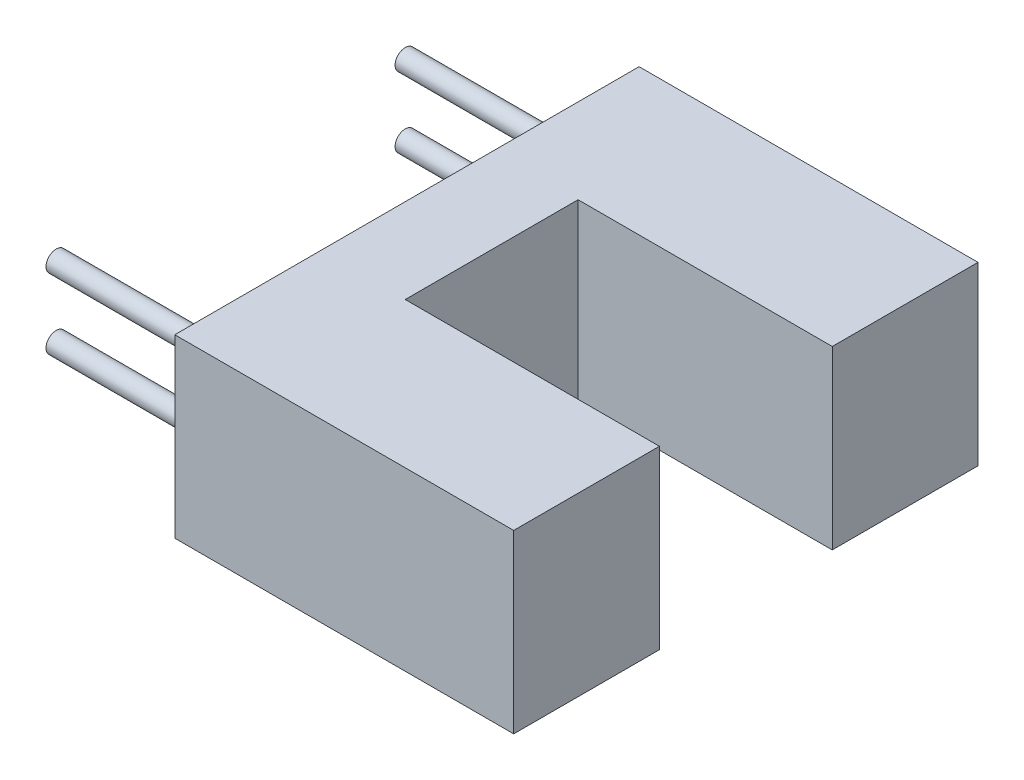
ISO-10303-21;
HEADER;
FILE_DESCRIPTION(('STEP AP214'),'2;1');
FILE_NAME('part.step','',(''),(''),'','','');
FILE_SCHEMA(('AUTOMOTIVE_DESIGN { 1 0 10303 214 1 1 1 1 }'));
ENDSEC;
DATA;
#1=APPLICATION_CONTEXT('core data for automotive mechanical design processes');
#2=APPLICATION_PROTOCOL_DEFINITION('international standard','automotive_design',2000,#1);
#3=PRODUCT_CONTEXT('',#1,'mechanical');
#4=PRODUCT('Part','Part','',(#3));
#5=PRODUCT_RELATED_PRODUCT_CATEGORY('part','',(#4));
#6=PRODUCT_DEFINITION_FORMATION('','',#4);
#7=PRODUCT_DEFINITION_CONTEXT('part definition',#1,'design');
#8=PRODUCT_DEFINITION('design','',#6,#7);
#9=PRODUCT_DEFINITION_SHAPE('','',#8);
#10=(LENGTH_UNIT() NAMED_UNIT(*) SI_UNIT(.MILLI.,.METRE.));
#11=(NAMED_UNIT(*) PLANE_ANGLE_UNIT() SI_UNIT($,.RADIAN.));
#12=(NAMED_UNIT(*) SI_UNIT($,.STERADIAN.) SOLID_ANGLE_UNIT());
#13=UNCERTAINTY_MEASURE_WITH_UNIT(LENGTH_MEASURE(1.E-05),#10,'distance_accuracy_value','');
#14=(GEOMETRIC_REPRESENTATION_CONTEXT(3) GLOBAL_UNCERTAINTY_ASSIGNED_CONTEXT((#13)) GLOBAL_UNIT_ASSIGNED_CONTEXT((#10,
#11,#12)) REPRESENTATION_CONTEXT('',''));
#15=CARTESIAN_POINT('',(0.,0.,0.));
#16=DIRECTION('',(0.,0.,1.));
#17=DIRECTION('',(1.,0.,0.));
#18=AXIS2_PLACEMENT_3D('',#15,#16,#17);
#19=CARTESIAN_POINT('',(10.,5.2,0.));
#20=DIRECTION('',(0.,0.,-1.));
#21=DIRECTION('',(-1.,0.,0.));
#22=AXIS2_PLACEMENT_3D('',#19,#20,#21);
#23=PLANE('',#22);
#24=DIRECTION('',(1.,0.,0.));
#25=VECTOR('',#24,1.);
#26=CARTESIAN_POINT('',(10.,0.,0.));
#27=LINE('',#26,#25);
#28=CARTESIAN_POINT('',(0.,0.,0.));
#29=VERTEX_POINT('',#28);
#30=CARTESIAN_POINT('',(10.,0.,0.));
#31=VERTEX_POINT('',#30);
#32=EDGE_CURVE('E129',#29,#31,#27,.T.);
#33=ORIENTED_EDGE('',*,*,#32,.T.);
#34=DIRECTION('',(0.,-1.,0.));
#35=VECTOR('',#34,1.);
#36=CARTESIAN_POINT('',(10.,5.2,0.));
#37=LINE('',#36,#35);
#38=CARTESIAN_POINT('',(10.,5.2,0.));
#39=VERTEX_POINT('',#38);
#40=EDGE_CURVE('E157',#39,#31,#37,.T.);
#41=ORIENTED_EDGE('',*,*,#40,.F.);
#42=DIRECTION('',(1.,0.,0.));
#43=VECTOR('',#42,1.);
#44=CARTESIAN_POINT('',(10.,5.2,0.));
#45=LINE('',#44,#43);
#46=CARTESIAN_POINT('',(0.,5.2,0.));
#47=VERTEX_POINT('',#46);
#48=EDGE_CURVE('E144',#47,#39,#45,.T.);
#49=ORIENTED_EDGE('',*,*,#48,.F.);
#50=DIRECTION('',(0.,-1.,0.));
#51=VECTOR('',#50,1.);
#52=CARTESIAN_POINT('',(0.,5.2,0.));
#53=LINE('',#52,#51);
#54=EDGE_CURVE('E125',#47,#29,#53,.T.);
#55=ORIENTED_EDGE('',*,*,#54,.T.);
#56=EDGE_LOOP('',(#33,#41,#49,#55));
#57=FACE_BOUND('',#56,.T.);
#58=ADVANCED_FACE('F32',(#57),#23,.F.);
#59=CARTESIAN_POINT('',(10.,5.2,-4.3));
#60=DIRECTION('',(-1.,0.,0.));
#61=DIRECTION('',(0.,0.,1.));
#62=AXIS2_PLACEMENT_3D('',#59,#60,#61);
#63=PLANE('',#62);
#64=DIRECTION('',(0.,0.,-1.));
#65=VECTOR('',#64,1.);
#66=CARTESIAN_POINT('',(10.,0.,-4.3));
#67=LINE('',#66,#65);
#68=CARTESIAN_POINT('',(10.,0.,-4.3));
#69=VERTEX_POINT('',#68);
#70=EDGE_CURVE('E132',#31,#69,#67,.T.);
#71=ORIENTED_EDGE('',*,*,#70,.T.);
#72=DIRECTION('',(0.,-1.,0.));
#73=VECTOR('',#72,1.);
#74=CARTESIAN_POINT('',(10.,5.2,-4.3));
#75=LINE('',#74,#73);
#76=CARTESIAN_POINT('',(10.,5.2,-4.3));
#77=VERTEX_POINT('',#76);
#78=EDGE_CURVE('E154',#77,#69,#75,.T.);
#79=ORIENTED_EDGE('',*,*,#78,.F.);
#80=DIRECTION('',(0.,0.,-1.));
#81=VECTOR('',#80,1.);
#82=CARTESIAN_POINT('',(10.,5.2,-4.3));
#83=LINE('',#82,#81);
#84=EDGE_CURVE('E92',#39,#77,#83,.T.);
#85=ORIENTED_EDGE('',*,*,#84,.F.);
#86=ORIENTED_EDGE('',*,*,#40,.T.);
#87=EDGE_LOOP('',(#71,#79,#85,#86));
#88=FACE_BOUND('',#87,.T.);
#89=ADVANCED_FACE('F196',(#88),#63,.F.);
#90=CARTESIAN_POINT('',(2.5,5.2,-4.3));
#91=DIRECTION('',(0.,0.,1.));
#92=DIRECTION('',(1.,0.,0.));
#93=AXIS2_PLACEMENT_3D('',#90,#91,#92);
#94=PLANE('',#93);
#95=DIRECTION('',(-1.,0.,0.));
#96=VECTOR('',#95,1.);
#97=CARTESIAN_POINT('',(2.5,0.,-4.3));
#98=LINE('',#97,#96);
#99=CARTESIAN_POINT('',(2.5,0.,-4.3));
#100=VERTEX_POINT('',#99);
#101=EDGE_CURVE('E135',#69,#100,#98,.T.);
#102=ORIENTED_EDGE('',*,*,#101,.T.);
#103=DIRECTION('',(0.,-1.,0.));
#104=VECTOR('',#103,1.);
#105=CARTESIAN_POINT('',(2.5,5.2,-4.3));
#106=LINE('',#105,#104);
#107=CARTESIAN_POINT('',(2.5,5.2,-4.3));
#108=VERTEX_POINT('',#107);
#109=EDGE_CURVE('E151',#108,#100,#106,.T.);
#110=ORIENTED_EDGE('',*,*,#109,.F.);
#111=DIRECTION('',(-1.,0.,0.));
#112=VECTOR('',#111,1.);
#113=CARTESIAN_POINT('',(2.5,5.2,-4.3));
#114=LINE('',#113,#112);
#115=EDGE_CURVE('E210',#77,#108,#114,.T.);
#116=ORIENTED_EDGE('',*,*,#115,.F.);
#117=ORIENTED_EDGE('',*,*,#78,.T.);
#118=EDGE_LOOP('',(#102,#110,#116,#117));
#119=FACE_BOUND('',#118,.T.);
#120=ADVANCED_FACE('F201',(#119),#94,.F.);
#121=CARTESIAN_POINT('',(2.5,5.2,-9.39999999999999));
#122=DIRECTION('',(-1.,0.,0.));
#123=DIRECTION('',(0.,0.,1.));
#124=AXIS2_PLACEMENT_3D('',#121,#122,#123);
#125=PLANE('',#124);
#126=DIRECTION('',(0.,0.,-1.));
#127=VECTOR('',#126,1.);
#128=CARTESIAN_POINT('',(2.5,0.,-9.39999999999999));
#129=LINE('',#128,#127);
#130=CARTESIAN_POINT('',(2.5,0.,-9.39999999999999));
#131=VERTEX_POINT('',#130);
#132=EDGE_CURVE('E137',#100,#131,#129,.T.);
#133=ORIENTED_EDGE('',*,*,#132,.T.);
#134=DIRECTION('',(0.,-1.,0.));
#135=VECTOR('',#134,1.);
#136=CARTESIAN_POINT('',(2.5,5.2,-9.39999999999999));
#137=LINE('',#136,#135);
#138=CARTESIAN_POINT('',(2.5,5.2,-9.39999999999999));
#139=VERTEX_POINT('',#138);
#140=EDGE_CURVE('E148',#139,#131,#137,.T.);
#141=ORIENTED_EDGE('',*,*,#140,.F.);
#142=DIRECTION('',(0.,0.,-1.));
#143=VECTOR('',#142,1.);
#144=CARTESIAN_POINT('',(2.5,5.2,-9.39999999999999));
#145=LINE('',#144,#143);
#146=EDGE_CURVE('E212',#108,#139,#145,.T.);
#147=ORIENTED_EDGE('',*,*,#146,.F.);
#148=ORIENTED_EDGE('',*,*,#109,.T.);
#149=EDGE_LOOP('',(#133,#141,#147,#148));
#150=FACE_BOUND('',#149,.T.);
#151=ADVANCED_FACE('F338',(#150),#125,.F.);
#152=CARTESIAN_POINT('',(10.,5.2,-9.4));
#153=DIRECTION('',(0.,0.,-1.));
#154=DIRECTION('',(-1.,0.,0.));
#155=AXIS2_PLACEMENT_3D('',#152,#153,#154);
#156=PLANE('',#155);
#157=DIRECTION('',(1.,0.,0.));
#158=VECTOR('',#157,1.);
#159=CARTESIAN_POINT('',(10.,0.,-9.4));
#160=LINE('',#159,#158);
#161=CARTESIAN_POINT('',(10.,0.,-9.4));
#162=VERTEX_POINT('',#161);
#163=EDGE_CURVE('E139',#131,#162,#160,.T.);
#164=ORIENTED_EDGE('',*,*,#163,.T.);
#165=DIRECTION('',(0.,-1.,0.));
#166=VECTOR('',#165,1.);
#167=CARTESIAN_POINT('',(10.,5.2,-9.4));
#168=LINE('',#167,#166);
#169=CARTESIAN_POINT('',(10.,5.2,-9.4));
#170=VERTEX_POINT('',#169);
#171=EDGE_CURVE('E120',#170,#162,#168,.T.);
#172=ORIENTED_EDGE('',*,*,#171,.F.);
#173=DIRECTION('',(1.,0.,0.));
#174=VECTOR('',#173,1.);
#175=CARTESIAN_POINT('',(10.,5.2,-9.4));
#176=LINE('',#175,#174);
#177=EDGE_CURVE('E111',#139,#170,#176,.T.);
#178=ORIENTED_EDGE('',*,*,#177,.F.);
#179=ORIENTED_EDGE('',*,*,#140,.T.);
#180=EDGE_LOOP('',(#164,#172,#178,#179));
#181=FACE_BOUND('',#180,.T.);
#182=ADVANCED_FACE('F330',(#181),#156,.F.);
#183=CARTESIAN_POINT('',(10.,5.2,-13.7));
#184=DIRECTION('',(-1.,0.,0.));
#185=DIRECTION('',(0.,0.,1.));
#186=AXIS2_PLACEMENT_3D('',#183,#184,#185);
#187=PLANE('',#186);
#188=DIRECTION('',(0.,0.,-1.));
#189=VECTOR('',#188,1.);
#190=CARTESIAN_POINT('',(10.,0.,-13.7));
#191=LINE('',#190,#189);
#192=CARTESIAN_POINT('',(10.,0.,-13.7));
#193=VERTEX_POINT('',#192);
#194=EDGE_CURVE('E119',#162,#193,#191,.T.);
#195=ORIENTED_EDGE('',*,*,#194,.T.);
#196=DIRECTION('',(0.,-1.,0.));
#197=VECTOR('',#196,1.);
#198=CARTESIAN_POINT('',(10.,5.2,-13.7));
#199=LINE('',#198,#197);
#200=CARTESIAN_POINT('',(10.,5.2,-13.7));
#201=VERTEX_POINT('',#200);
#202=EDGE_CURVE('E116',#201,#193,#199,.T.);
#203=ORIENTED_EDGE('',*,*,#202,.F.);
#204=DIRECTION('',(0.,0.,-1.));
#205=VECTOR('',#204,1.);
#206=CARTESIAN_POINT('',(10.,5.2,-13.7));
#207=LINE('',#206,#205);
#208=EDGE_CURVE('E105',#170,#201,#207,.T.);
#209=ORIENTED_EDGE('',*,*,#208,.F.);
#210=ORIENTED_EDGE('',*,*,#171,.T.);
#211=EDGE_LOOP('',(#195,#203,#209,#210));
#212=FACE_BOUND('',#211,.T.);
#213=ADVANCED_FACE('F117',(#212),#187,.F.);
#214=CARTESIAN_POINT('',(0.,5.2,-13.7));
#215=DIRECTION('',(0.,0.,1.));
#216=DIRECTION('',(1.,0.,0.));
#217=AXIS2_PLACEMENT_3D('',#214,#215,#216);
#218=PLANE('',#217);
#219=DIRECTION('',(-1.,0.,0.));
#220=VECTOR('',#219,1.);
#221=CARTESIAN_POINT('',(0.,0.,-13.7));
#222=LINE('',#221,#220);
#223=CARTESIAN_POINT('',(0.,0.,-13.7));
#224=VERTEX_POINT('',#223);
#225=EDGE_CURVE('E77',#193,#224,#222,.T.);
#226=ORIENTED_EDGE('',*,*,#225,.T.);
#227=DIRECTION('',(0.,-1.,0.));
#228=VECTOR('',#227,1.);
#229=CARTESIAN_POINT('',(0.,5.2,-13.7));
#230=LINE('',#229,#228);
#231=CARTESIAN_POINT('',(0.,5.2,-13.7));
#232=VERTEX_POINT('',#231);
#233=EDGE_CURVE('E121',#232,#224,#230,.T.);
#234=ORIENTED_EDGE('',*,*,#233,.F.);
#235=DIRECTION('',(-1.,0.,0.));
#236=VECTOR('',#235,1.);
#237=CARTESIAN_POINT('',(0.,5.2,-13.7));
#238=LINE('',#237,#236);
#239=EDGE_CURVE('E109',#201,#232,#238,.T.);
#240=ORIENTED_EDGE('',*,*,#239,.F.);
#241=ORIENTED_EDGE('',*,*,#202,.T.);
#242=EDGE_LOOP('',(#226,#234,#240,#241));
#243=FACE_BOUND('',#242,.T.);
#244=ADVANCED_FACE('F123',(#243),#218,.F.);
#245=CARTESIAN_POINT('',(0.,5.2,0.));
#246=DIRECTION('',(1.,0.,0.));
#247=DIRECTION('',(0.,0.,-1.));
#248=AXIS2_PLACEMENT_3D('',#245,#246,#247);
#249=PLANE('',#248);
#250=CARTESIAN_POINT('',(0.,1.56,-12.));
#251=DIRECTION('',(1.,0.,0.));
#252=DIRECTION('',(0.,0.,-1.));
#253=AXIS2_PLACEMENT_3D('',#250,#251,#252);
#254=CIRCLE('',#253,0.3);
#255=CARTESIAN_POINT('',(0.,1.56,-12.3));
#256=VERTEX_POINT('',#255);
#257=EDGE_CURVE('E11',#256,#256,#254,.F.);
#258=ORIENTED_EDGE('',*,*,#257,.F.);
#259=EDGE_LOOP('',(#258));
#260=FACE_BOUND('',#259,.T.);
#261=CARTESIAN_POINT('',(0.,1.56,-1.7));
#262=DIRECTION('',(1.,0.,0.));
#263=DIRECTION('',(0.,0.,-1.));
#264=AXIS2_PLACEMENT_3D('',#261,#262,#263);
#265=CIRCLE('',#264,0.3);
#266=CARTESIAN_POINT('',(0.,1.56,-2.));
#267=VERTEX_POINT('',#266);
#268=EDGE_CURVE('E40',#267,#267,#265,.F.);
#269=ORIENTED_EDGE('',*,*,#268,.F.);
#270=EDGE_LOOP('',(#269));
#271=FACE_BOUND('',#270,.T.);
#272=CARTESIAN_POINT('',(0.,3.64,-1.7));
#273=DIRECTION('',(1.,0.,0.));
#274=DIRECTION('',(0.,0.,-1.));
#275=AXIS2_PLACEMENT_3D('',#272,#273,#274);
#276=CIRCLE('',#275,0.3);
#277=CARTESIAN_POINT('',(0.,3.64,-2.));
#278=VERTEX_POINT('',#277);
#279=EDGE_CURVE('E162',#278,#278,#276,.F.);
#280=ORIENTED_EDGE('',*,*,#279,.F.);
#281=EDGE_LOOP('',(#280));
#282=FACE_BOUND('',#281,.T.);
#283=CARTESIAN_POINT('',(0.,3.64,-12.));
#284=DIRECTION('',(1.,0.,0.));
#285=DIRECTION('',(0.,0.,-1.));
#286=AXIS2_PLACEMENT_3D('',#283,#284,#285);
#287=CIRCLE('',#286,0.3);
#288=CARTESIAN_POINT('',(0.,3.64,-12.3));
#289=VERTEX_POINT('',#288);
#290=EDGE_CURVE('E159',#289,#289,#287,.F.);
#291=ORIENTED_EDGE('',*,*,#290,.F.);
#292=EDGE_LOOP('',(#291));
#293=FACE_BOUND('',#292,.T.);
#294=DIRECTION('',(0.,0.,1.));
#295=VECTOR('',#294,1.);
#296=CARTESIAN_POINT('',(0.,0.,0.));
#297=LINE('',#296,#295);
#298=EDGE_CURVE('E83',#224,#29,#297,.T.);
#299=ORIENTED_EDGE('',*,*,#298,.T.);
#300=ORIENTED_EDGE('',*,*,#54,.F.);
#301=DIRECTION('',(0.,0.,1.));
#302=VECTOR('',#301,1.);
#303=CARTESIAN_POINT('',(0.,5.2,0.));
#304=LINE('',#303,#302);
#305=EDGE_CURVE('E48',#232,#47,#304,.T.);
#306=ORIENTED_EDGE('',*,*,#305,.F.);
#307=ORIENTED_EDGE('',*,*,#233,.T.);
#308=EDGE_LOOP('',(#299,#300,#306,#307));
#309=FACE_BOUND('',#308,.T.);
#310=ADVANCED_FACE('F169',(#260,#271,#282,#293,#309),#249,.F.);
#311=CARTESIAN_POINT('',(0.,5.2,0.));
#312=DIRECTION('',(0.,-1.,0.));
#313=DIRECTION('',(0.,0.,-1.));
#314=AXIS2_PLACEMENT_3D('',#311,#312,#313);
#315=PLANE('',#314);
#316=ORIENTED_EDGE('',*,*,#48,.T.);
#317=ORIENTED_EDGE('',*,*,#84,.T.);
#318=ORIENTED_EDGE('',*,*,#115,.T.);
#319=ORIENTED_EDGE('',*,*,#146,.T.);
#320=ORIENTED_EDGE('',*,*,#177,.T.);
#321=ORIENTED_EDGE('',*,*,#208,.T.);
#322=ORIENTED_EDGE('',*,*,#239,.T.);
#323=ORIENTED_EDGE('',*,*,#305,.T.);
#324=EDGE_LOOP('',(#316,#317,#318,#319,#320,#321,#322,#323));
#325=FACE_BOUND('',#324,.T.);
#326=ADVANCED_FACE('F107',(#325),#315,.F.);
#327=CARTESIAN_POINT('',(0.,0.,0.));
#328=DIRECTION('',(0.,-1.,0.));
#329=DIRECTION('',(0.,0.,-1.));
#330=AXIS2_PLACEMENT_3D('',#327,#328,#329);
#331=PLANE('',#330);
#332=ORIENTED_EDGE('',*,*,#32,.F.);
#333=ORIENTED_EDGE('',*,*,#298,.F.);
#334=ORIENTED_EDGE('',*,*,#225,.F.);
#335=ORIENTED_EDGE('',*,*,#194,.F.);
#336=ORIENTED_EDGE('',*,*,#163,.F.);
#337=ORIENTED_EDGE('',*,*,#132,.F.);
#338=ORIENTED_EDGE('',*,*,#101,.F.);
#339=ORIENTED_EDGE('',*,*,#70,.F.);
#340=EDGE_LOOP('',(#332,#333,#334,#335,#336,#337,#338,#339));
#341=FACE_BOUND('',#340,.T.);
#342=ADVANCED_FACE('F181',(#341),#331,.T.);
#343=CARTESIAN_POINT('',(-5.2,3.64,-12.));
#344=DIRECTION('',(1.,0.,0.));
#345=DIRECTION('',(0.,0.,-1.));
#346=AXIS2_PLACEMENT_3D('',#343,#344,#345);
#347=CYLINDRICAL_SURFACE('',#346,0.3);
#348=CARTESIAN_POINT('',(-5.2,3.64,-12.));
#349=DIRECTION('',(-1.,0.,0.));
#350=DIRECTION('',(0.,0.,1.));
#351=AXIS2_PLACEMENT_3D('',#348,#349,#350);
#352=CIRCLE('',#351,0.3);
#353=CARTESIAN_POINT('',(-5.2,3.64,-11.7));
#354=VERTEX_POINT('',#353);
#355=EDGE_CURVE('E133',#354,#354,#352,.T.);
#356=ORIENTED_EDGE('',*,*,#355,.F.);
#357=EDGE_LOOP('',(#356));
#358=FACE_BOUND('',#357,.T.);
#359=ORIENTED_EDGE('',*,*,#290,.T.);
#360=EDGE_LOOP('',(#359));
#361=FACE_BOUND('',#360,.T.);
#362=ADVANCED_FACE('F178',(#358,#361),#347,.T.);
#363=CARTESIAN_POINT('',(-5.2,3.64,-12.));
#364=DIRECTION('',(-1.,0.,0.));
#365=DIRECTION('',(0.,0.,1.));
#366=AXIS2_PLACEMENT_3D('',#363,#364,#365);
#367=PLANE('',#366);
#368=ORIENTED_EDGE('',*,*,#355,.T.);
#369=EDGE_LOOP('',(#368));
#370=FACE_BOUND('',#369,.T.);
#371=ADVANCED_FACE('F180',(#370),#367,.T.);
#372=CARTESIAN_POINT('',(-5.2,3.64,-1.7));
#373=DIRECTION('',(1.,0.,0.));
#374=DIRECTION('',(0.,0.,-1.));
#375=AXIS2_PLACEMENT_3D('',#372,#373,#374);
#376=CYLINDRICAL_SURFACE('',#375,0.3);
#377=CARTESIAN_POINT('',(-5.2,3.64,-1.7));
#378=DIRECTION('',(-1.,0.,0.));
#379=DIRECTION('',(0.,0.,1.));
#380=AXIS2_PLACEMENT_3D('',#377,#378,#379);
#381=CIRCLE('',#380,0.3);
#382=CARTESIAN_POINT('',(-5.2,3.64,-1.4));
#383=VERTEX_POINT('',#382);
#384=EDGE_CURVE('E220',#383,#383,#381,.T.);
#385=ORIENTED_EDGE('',*,*,#384,.F.);
#386=EDGE_LOOP('',(#385));
#387=FACE_BOUND('',#386,.T.);
#388=ORIENTED_EDGE('',*,*,#279,.T.);
#389=EDGE_LOOP('',(#388));
#390=FACE_BOUND('',#389,.T.);
#391=ADVANCED_FACE('F188',(#387,#390),#376,.T.);
#392=CARTESIAN_POINT('',(-5.2,3.64,-1.7));
#393=DIRECTION('',(-1.,0.,0.));
#394=DIRECTION('',(0.,0.,1.));
#395=AXIS2_PLACEMENT_3D('',#392,#393,#394);
#396=PLANE('',#395);
#397=ORIENTED_EDGE('',*,*,#384,.T.);
#398=EDGE_LOOP('',(#397));
#399=FACE_BOUND('',#398,.T.);
#400=ADVANCED_FACE('F248',(#399),#396,.T.);
#401=CARTESIAN_POINT('',(-5.2,1.56,-1.7));
#402=DIRECTION('',(1.,0.,0.));
#403=DIRECTION('',(0.,0.,-1.));
#404=AXIS2_PLACEMENT_3D('',#401,#402,#403);
#405=CYLINDRICAL_SURFACE('',#404,0.3);
#406=CARTESIAN_POINT('',(-5.2,1.56,-1.7));
#407=DIRECTION('',(-1.,0.,0.));
#408=DIRECTION('',(0.,0.,1.));
#409=AXIS2_PLACEMENT_3D('',#406,#407,#408);
#410=CIRCLE('',#409,0.3);
#411=CARTESIAN_POINT('',(-5.2,1.56,-1.4));
#412=VERTEX_POINT('',#411);
#413=EDGE_CURVE('E223',#412,#412,#410,.T.);
#414=ORIENTED_EDGE('',*,*,#413,.F.);
#415=EDGE_LOOP('',(#414));
#416=FACE_BOUND('',#415,.T.);
#417=ORIENTED_EDGE('',*,*,#268,.T.);
#418=EDGE_LOOP('',(#417));
#419=FACE_BOUND('',#418,.T.);
#420=ADVANCED_FACE('F167',(#416,#419),#405,.T.);
#421=CARTESIAN_POINT('',(-5.2,1.56,-1.7));
#422=DIRECTION('',(-1.,0.,0.));
#423=DIRECTION('',(0.,0.,1.));
#424=AXIS2_PLACEMENT_3D('',#421,#422,#423);
#425=PLANE('',#424);
#426=ORIENTED_EDGE('',*,*,#413,.T.);
#427=EDGE_LOOP('',(#426));
#428=FACE_BOUND('',#427,.T.);
#429=ADVANCED_FACE('F235',(#428),#425,.T.);
#430=CARTESIAN_POINT('',(-5.2,1.56,-12.));
#431=DIRECTION('',(1.,0.,0.));
#432=DIRECTION('',(0.,0.,-1.));
#433=AXIS2_PLACEMENT_3D('',#430,#431,#432);
#434=CYLINDRICAL_SURFACE('',#433,0.3);
#435=CARTESIAN_POINT('',(-5.2,1.56,-12.));
#436=DIRECTION('',(-1.,0.,0.));
#437=DIRECTION('',(0.,0.,1.));
#438=AXIS2_PLACEMENT_3D('',#435,#436,#437);
#439=CIRCLE('',#438,0.3);
#440=CARTESIAN_POINT('',(-5.2,1.56,-11.7));
#441=VERTEX_POINT('',#440);
#442=EDGE_CURVE('E226',#441,#441,#439,.T.);
#443=ORIENTED_EDGE('',*,*,#442,.F.);
#444=EDGE_LOOP('',(#443));
#445=FACE_BOUND('',#444,.T.);
#446=ORIENTED_EDGE('',*,*,#257,.T.);
#447=EDGE_LOOP('',(#446));
#448=FACE_BOUND('',#447,.T.);
#449=ADVANCED_FACE('F232',(#445,#448),#434,.T.);
#450=CARTESIAN_POINT('',(-5.2,1.56,-12.));
#451=DIRECTION('',(-1.,0.,0.));
#452=DIRECTION('',(0.,0.,1.));
#453=AXIS2_PLACEMENT_3D('',#450,#451,#452);
#454=PLANE('',#453);
#455=ORIENTED_EDGE('',*,*,#442,.T.);
#456=EDGE_LOOP('',(#455));
#457=FACE_BOUND('',#456,.T.);
#458=ADVANCED_FACE('F230',(#457),#454,.T.);
#459=CLOSED_SHELL('',(#58,#89,#120,#151,#182,#213,#244,#310,#326,#342,#362,#371,#391,#400,#420,
#429,#449,#458));
#460=MANIFOLD_SOLID_BREP('B2',#459);
#461=ADVANCED_BREP_SHAPE_REPRESENTATION('',(#18,#460),#14);
#462=SHAPE_DEFINITION_REPRESENTATION(#9,#461);
ENDSEC;
END-ISO-10303-21;
